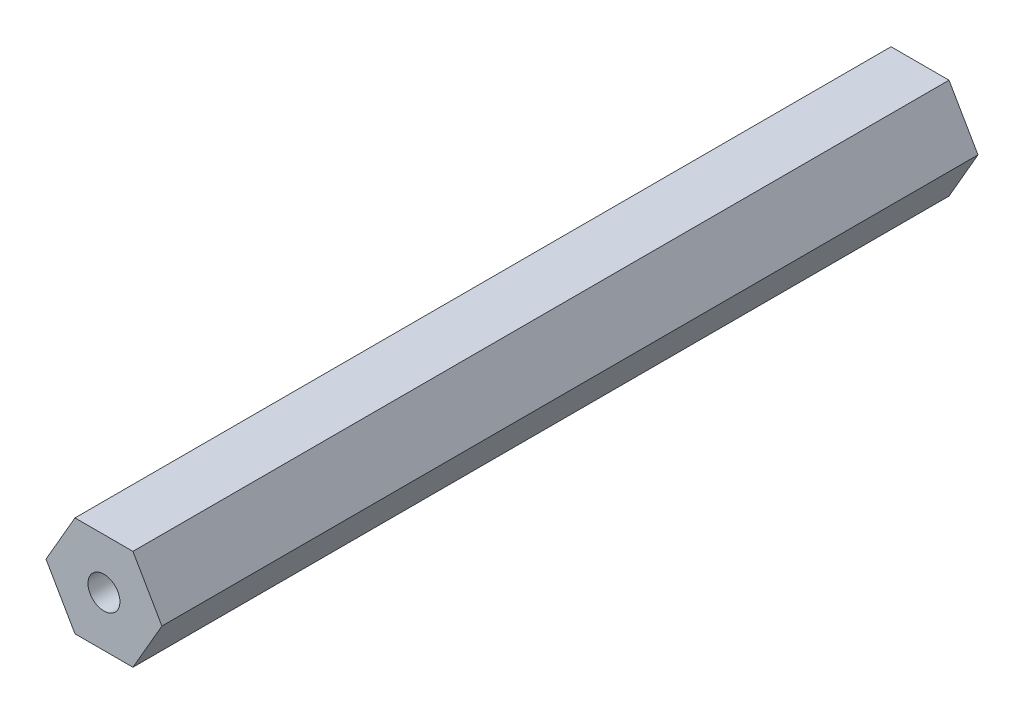
ISO-10303-21;
HEADER;
FILE_DESCRIPTION(('STEP AP214'),'2;1');
FILE_NAME('part.step','',(''),(''),'','','');
FILE_SCHEMA(('AUTOMOTIVE_DESIGN { 1 0 10303 214 1 1 1 1 }'));
ENDSEC;
DATA;
#1=APPLICATION_CONTEXT('core data for automotive mechanical design processes');
#2=APPLICATION_PROTOCOL_DEFINITION('international standard','automotive_design',2000,#1);
#3=PRODUCT_CONTEXT('',#1,'mechanical');
#4=PRODUCT('Part','Part','',(#3));
#5=PRODUCT_RELATED_PRODUCT_CATEGORY('part','',(#4));
#6=PRODUCT_DEFINITION_FORMATION('','',#4);
#7=PRODUCT_DEFINITION_CONTEXT('part definition',#1,'design');
#8=PRODUCT_DEFINITION('design','',#6,#7);
#9=PRODUCT_DEFINITION_SHAPE('','',#8);
#10=(LENGTH_UNIT() NAMED_UNIT(*) SI_UNIT(.MILLI.,.METRE.));
#11=(NAMED_UNIT(*) PLANE_ANGLE_UNIT() SI_UNIT($,.RADIAN.));
#12=(NAMED_UNIT(*) SI_UNIT($,.STERADIAN.) SOLID_ANGLE_UNIT());
#13=UNCERTAINTY_MEASURE_WITH_UNIT(LENGTH_MEASURE(1.E-05),#10,'distance_accuracy_value','');
#14=(GEOMETRIC_REPRESENTATION_CONTEXT(3) GLOBAL_UNCERTAINTY_ASSIGNED_CONTEXT((#13)) GLOBAL_UNIT_ASSIGNED_CONTEXT((#10,
#11,#12)) REPRESENTATION_CONTEXT('',''));
#15=CARTESIAN_POINT('',(0.,0.,0.));
#16=DIRECTION('',(0.,0.,1.));
#17=DIRECTION('',(1.,0.,0.));
#18=AXIS2_PLACEMENT_3D('',#15,#16,#17);
#19=CARTESIAN_POINT('',(0.,0.,103.251));
#20=DIRECTION('',(0.,0.,1.));
#21=DIRECTION('',(1.,0.,0.));
#22=AXIS2_PLACEMENT_3D('',#19,#20,#21);
#23=PLANE('',#22);
#24=CARTESIAN_POINT('',(0.,0.,103.251));
#25=DIRECTION('',(0.,0.,1.));
#26=DIRECTION('',(1.,0.,0.));
#27=AXIS2_PLACEMENT_3D('',#24,#25,#26);
#28=CIRCLE('',#27,2.0193);
#29=CARTESIAN_POINT('',(2.0193,0.,103.251));
#30=VERTEX_POINT('',#29);
#31=EDGE_CURVE('E11',#30,#30,#28,.T.);
#32=ORIENTED_EDGE('',*,*,#31,.F.);
#33=EDGE_LOOP('',(#32));
#34=FACE_BOUND('',#33,.T.);
#35=DIRECTION('',(0.5,0.866025403784439,0.));
#36=VECTOR('',#35,1.);
#37=CARTESIAN_POINT('',(3.66617420935412,-6.35,103.251));
#38=LINE('',#37,#36);
#39=CARTESIAN_POINT('',(3.66617420935412,-6.35,103.251));
#40=VERTEX_POINT('',#39);
#41=CARTESIAN_POINT('',(7.33234841870825,0.,103.251));
#42=VERTEX_POINT('',#41);
#43=EDGE_CURVE('E122',#40,#42,#38,.T.);
#44=ORIENTED_EDGE('',*,*,#43,.T.);
#45=DIRECTION('',(-0.5,0.866025403784438,0.));
#46=VECTOR('',#45,1.);
#47=CARTESIAN_POINT('',(7.33234841870825,0.,103.251));
#48=LINE('',#47,#46);
#49=CARTESIAN_POINT('',(3.66617420935412,6.35,103.251));
#50=VERTEX_POINT('',#49);
#51=EDGE_CURVE('E125',#42,#50,#48,.T.);
#52=ORIENTED_EDGE('',*,*,#51,.T.);
#53=DIRECTION('',(-1.,0.,0.));
#54=VECTOR('',#53,1.);
#55=CARTESIAN_POINT('',(3.66617420935412,6.35,103.251));
#56=LINE('',#55,#54);
#57=CARTESIAN_POINT('',(-3.66617420935413,6.35,103.251));
#58=VERTEX_POINT('',#57);
#59=EDGE_CURVE('E128',#50,#58,#56,.T.);
#60=ORIENTED_EDGE('',*,*,#59,.T.);
#61=DIRECTION('',(-0.5,-0.866025403784439,0.));
#62=VECTOR('',#61,1.);
#63=CARTESIAN_POINT('',(-3.66617420935413,6.35,103.251));
#64=LINE('',#63,#62);
#65=CARTESIAN_POINT('',(-7.33234841870825,0.,103.251));
#66=VERTEX_POINT('',#65);
#67=EDGE_CURVE('E131',#58,#66,#64,.T.);
#68=ORIENTED_EDGE('',*,*,#67,.T.);
#69=DIRECTION('',(0.5,-0.866025403784439,0.));
#70=VECTOR('',#69,1.);
#71=CARTESIAN_POINT('',(-7.33234841870825,0.,103.251));
#72=LINE('',#71,#70);
#73=CARTESIAN_POINT('',(-3.66617420935412,-6.35,103.251));
#74=VERTEX_POINT('',#73);
#75=EDGE_CURVE('E100',#66,#74,#72,.T.);
#76=ORIENTED_EDGE('',*,*,#75,.T.);
#77=DIRECTION('',(1.,0.,0.));
#78=VECTOR('',#77,1.);
#79=CARTESIAN_POINT('',(-3.66617420935412,-6.35,103.251));
#80=LINE('',#79,#78);
#81=EDGE_CURVE('E134',#74,#40,#80,.T.);
#82=ORIENTED_EDGE('',*,*,#81,.T.);
#83=EDGE_LOOP('',(#44,#52,#60,#68,#76,#82));
#84=FACE_BOUND('',#83,.T.);
#85=ADVANCED_FACE('F35',(#34,#84),#23,.T.);
#86=CARTESIAN_POINT('',(0.,0.,0.));
#87=DIRECTION('',(0.,0.,1.));
#88=DIRECTION('',(1.,0.,0.));
#89=AXIS2_PLACEMENT_3D('',#86,#87,#88);
#90=PLANE('',#89);
#91=CARTESIAN_POINT('',(0.,0.,0.));
#92=DIRECTION('',(0.,0.,1.));
#93=DIRECTION('',(1.,0.,0.));
#94=AXIS2_PLACEMENT_3D('',#91,#92,#93);
#95=CIRCLE('',#94,2.0193);
#96=CARTESIAN_POINT('',(2.0193,0.,0.));
#97=VERTEX_POINT('',#96);
#98=EDGE_CURVE('E39',#97,#97,#95,.T.);
#99=ORIENTED_EDGE('',*,*,#98,.T.);
#100=EDGE_LOOP('',(#99));
#101=FACE_BOUND('',#100,.T.);
#102=DIRECTION('',(0.5,0.866025403784439,0.));
#103=VECTOR('',#102,1.);
#104=CARTESIAN_POINT('',(3.66617420935412,-6.35,0.));
#105=LINE('',#104,#103);
#106=CARTESIAN_POINT('',(3.66617420935412,-6.35,0.));
#107=VERTEX_POINT('',#106);
#108=CARTESIAN_POINT('',(7.33234841870825,0.,0.));
#109=VERTEX_POINT('',#108);
#110=EDGE_CURVE('E137',#107,#109,#105,.T.);
#111=ORIENTED_EDGE('',*,*,#110,.F.);
#112=DIRECTION('',(1.,0.,0.));
#113=VECTOR('',#112,1.);
#114=CARTESIAN_POINT('',(-3.66617420935412,-6.35,0.));
#115=LINE('',#114,#113);
#116=CARTESIAN_POINT('',(-3.66617420935412,-6.35,0.));
#117=VERTEX_POINT('',#116);
#118=EDGE_CURVE('E112',#117,#107,#115,.T.);
#119=ORIENTED_EDGE('',*,*,#118,.F.);
#120=DIRECTION('',(0.5,-0.866025403784439,0.));
#121=VECTOR('',#120,1.);
#122=CARTESIAN_POINT('',(-7.33234841870825,0.,0.));
#123=LINE('',#122,#121);
#124=CARTESIAN_POINT('',(-7.33234841870825,0.,0.));
#125=VERTEX_POINT('',#124);
#126=EDGE_CURVE('E98',#125,#117,#123,.T.);
#127=ORIENTED_EDGE('',*,*,#126,.F.);
#128=DIRECTION('',(-0.5,-0.866025403784439,0.));
#129=VECTOR('',#128,1.);
#130=CARTESIAN_POINT('',(-3.66617420935413,6.35,0.));
#131=LINE('',#130,#129);
#132=CARTESIAN_POINT('',(-3.66617420935413,6.35,0.));
#133=VERTEX_POINT('',#132);
#134=EDGE_CURVE('E110',#133,#125,#131,.T.);
#135=ORIENTED_EDGE('',*,*,#134,.F.);
#136=DIRECTION('',(-1.,0.,0.));
#137=VECTOR('',#136,1.);
#138=CARTESIAN_POINT('',(3.66617420935412,6.35,0.));
#139=LINE('',#138,#137);
#140=CARTESIAN_POINT('',(3.66617420935412,6.35,0.));
#141=VERTEX_POINT('',#140);
#142=EDGE_CURVE('E115',#141,#133,#139,.T.);
#143=ORIENTED_EDGE('',*,*,#142,.F.);
#144=DIRECTION('',(-0.5,0.866025403784438,0.));
#145=VECTOR('',#144,1.);
#146=CARTESIAN_POINT('',(7.33234841870825,0.,0.));
#147=LINE('',#146,#145);
#148=EDGE_CURVE('E117',#109,#141,#147,.T.);
#149=ORIENTED_EDGE('',*,*,#148,.F.);
#150=EDGE_LOOP('',(#111,#119,#127,#135,#143,#149));
#151=FACE_BOUND('',#150,.T.);
#152=ADVANCED_FACE('F37',(#101,#151),#90,.F.);
#153=CARTESIAN_POINT('',(0.,0.,103.251));
#154=DIRECTION('',(0.,0.,-1.));
#155=DIRECTION('',(-1.,0.,0.));
#156=AXIS2_PLACEMENT_3D('',#153,#154,#155);
#157=CYLINDRICAL_SURFACE('',#156,2.0193);
#158=ORIENTED_EDGE('',*,*,#31,.T.);
#159=EDGE_LOOP('',(#158));
#160=FACE_BOUND('',#159,.T.);
#161=ORIENTED_EDGE('',*,*,#98,.F.);
#162=EDGE_LOOP('',(#161));
#163=FACE_BOUND('',#162,.T.);
#164=ADVANCED_FACE('F155',(#160,#163),#157,.F.);
#165=CARTESIAN_POINT('',(3.66617420935412,-6.35,0.));
#166=DIRECTION('',(0.866025403784439,-0.5,0.));
#167=DIRECTION('',(0.5,0.866025403784439,0.));
#168=AXIS2_PLACEMENT_3D('',#165,#166,#167);
#169=PLANE('',#168);
#170=ORIENTED_EDGE('',*,*,#43,.F.);
#171=DIRECTION('',(0.,0.,1.));
#172=VECTOR('',#171,1.);
#173=CARTESIAN_POINT('',(3.66617420935412,-6.35,0.));
#174=LINE('',#173,#172);
#175=EDGE_CURVE('E52',#107,#40,#174,.T.);
#176=ORIENTED_EDGE('',*,*,#175,.F.);
#177=ORIENTED_EDGE('',*,*,#110,.T.);
#178=DIRECTION('',(0.,0.,1.));
#179=VECTOR('',#178,1.);
#180=CARTESIAN_POINT('',(7.33234841870825,0.,0.));
#181=LINE('',#180,#179);
#182=EDGE_CURVE('E87',#109,#42,#181,.T.);
#183=ORIENTED_EDGE('',*,*,#182,.T.);
#184=EDGE_LOOP('',(#170,#176,#177,#183));
#185=FACE_BOUND('',#184,.T.);
#186=ADVANCED_FACE('F143',(#185),#169,.T.);
#187=CARTESIAN_POINT('',(-3.66617420935412,-6.35,0.));
#188=DIRECTION('',(0.,-1.,0.));
#189=DIRECTION('',(1.,0.,0.));
#190=AXIS2_PLACEMENT_3D('',#187,#188,#189);
#191=PLANE('',#190);
#192=ORIENTED_EDGE('',*,*,#81,.F.);
#193=DIRECTION('',(0.,0.,1.));
#194=VECTOR('',#193,1.);
#195=CARTESIAN_POINT('',(-3.66617420935412,-6.35,0.));
#196=LINE('',#195,#194);
#197=EDGE_CURVE('E75',#117,#74,#196,.T.);
#198=ORIENTED_EDGE('',*,*,#197,.F.);
#199=ORIENTED_EDGE('',*,*,#118,.T.);
#200=ORIENTED_EDGE('',*,*,#175,.T.);
#201=EDGE_LOOP('',(#192,#198,#199,#200));
#202=FACE_BOUND('',#201,.T.);
#203=ADVANCED_FACE('F147',(#202),#191,.T.);
#204=CARTESIAN_POINT('',(-7.33234841870825,0.,0.));
#205=DIRECTION('',(-0.866025403784439,-0.5,0.));
#206=DIRECTION('',(0.5,-0.866025403784439,0.));
#207=AXIS2_PLACEMENT_3D('',#204,#205,#206);
#208=PLANE('',#207);
#209=ORIENTED_EDGE('',*,*,#75,.F.);
#210=DIRECTION('',(0.,0.,1.));
#211=VECTOR('',#210,1.);
#212=CARTESIAN_POINT('',(-7.33234841870825,0.,0.));
#213=LINE('',#212,#211);
#214=EDGE_CURVE('E95',#125,#66,#213,.T.);
#215=ORIENTED_EDGE('',*,*,#214,.F.);
#216=ORIENTED_EDGE('',*,*,#126,.T.);
#217=ORIENTED_EDGE('',*,*,#197,.T.);
#218=EDGE_LOOP('',(#209,#215,#216,#217));
#219=FACE_BOUND('',#218,.T.);
#220=ADVANCED_FACE('F97',(#219),#208,.T.);
#221=CARTESIAN_POINT('',(-3.66617420935413,6.35,0.));
#222=DIRECTION('',(-0.866025403784439,0.5,0.));
#223=DIRECTION('',(-0.5,-0.866025403784439,0.));
#224=AXIS2_PLACEMENT_3D('',#221,#222,#223);
#225=PLANE('',#224);
#226=ORIENTED_EDGE('',*,*,#67,.F.);
#227=DIRECTION('',(0.,0.,1.));
#228=VECTOR('',#227,1.);
#229=CARTESIAN_POINT('',(-3.66617420935413,6.35,0.));
#230=LINE('',#229,#228);
#231=EDGE_CURVE('E105',#133,#58,#230,.T.);
#232=ORIENTED_EDGE('',*,*,#231,.F.);
#233=ORIENTED_EDGE('',*,*,#134,.T.);
#234=ORIENTED_EDGE('',*,*,#214,.T.);
#235=EDGE_LOOP('',(#226,#232,#233,#234));
#236=FACE_BOUND('',#235,.T.);
#237=ADVANCED_FACE('F114',(#236),#225,.T.);
#238=CARTESIAN_POINT('',(3.66617420935412,6.35,0.));
#239=DIRECTION('',(0.,1.,0.));
#240=DIRECTION('',(0.,0.,1.));
#241=AXIS2_PLACEMENT_3D('',#238,#239,#240);
#242=PLANE('',#241);
#243=ORIENTED_EDGE('',*,*,#59,.F.);
#244=DIRECTION('',(0.,0.,1.));
#245=VECTOR('',#244,1.);
#246=CARTESIAN_POINT('',(3.66617420935412,6.35,0.));
#247=LINE('',#246,#245);
#248=EDGE_CURVE('E141',#141,#50,#247,.T.);
#249=ORIENTED_EDGE('',*,*,#248,.F.);
#250=ORIENTED_EDGE('',*,*,#142,.T.);
#251=ORIENTED_EDGE('',*,*,#231,.T.);
#252=EDGE_LOOP('',(#243,#249,#250,#251));
#253=FACE_BOUND('',#252,.T.);
#254=ADVANCED_FACE('F170',(#253),#242,.T.);
#255=CARTESIAN_POINT('',(7.33234841870825,0.,0.));
#256=DIRECTION('',(0.866025403784439,0.5,0.));
#257=DIRECTION('',(-0.5,0.866025403784439,0.));
#258=AXIS2_PLACEMENT_3D('',#255,#256,#257);
#259=PLANE('',#258);
#260=ORIENTED_EDGE('',*,*,#51,.F.);
#261=ORIENTED_EDGE('',*,*,#182,.F.);
#262=ORIENTED_EDGE('',*,*,#148,.T.);
#263=ORIENTED_EDGE('',*,*,#248,.T.);
#264=EDGE_LOOP('',(#260,#261,#262,#263));
#265=FACE_BOUND('',#264,.T.);
#266=ADVANCED_FACE('F144',(#265),#259,.T.);
#267=CLOSED_SHELL('',(#85,#152,#164,#186,#203,#220,#237,#254,#266));
#268=MANIFOLD_SOLID_BREP('B2',#267);
#269=ADVANCED_BREP_SHAPE_REPRESENTATION('',(#18,#268),#14);
#270=SHAPE_DEFINITION_REPRESENTATION(#9,#269);
ENDSEC;
END-ISO-10303-21;
